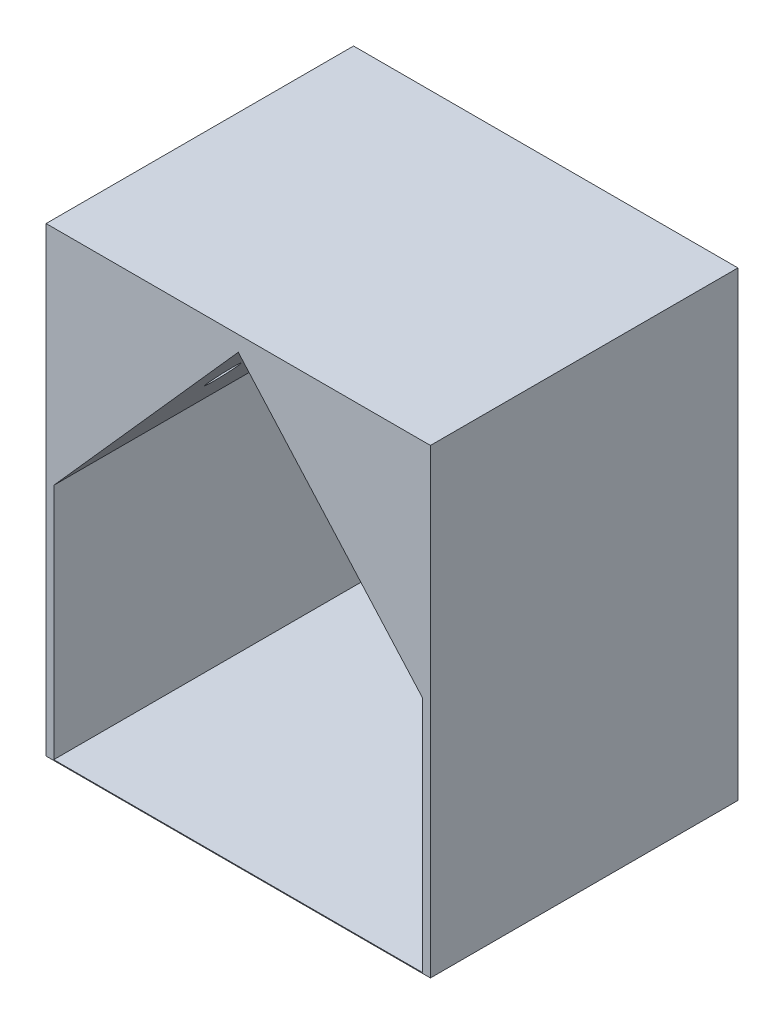
ISO-10303-21;
HEADER;
FILE_DESCRIPTION(('STEP AP214'),'2;1');
FILE_NAME('part.step','',(''),(''),'','','');
FILE_SCHEMA(('AUTOMOTIVE_DESIGN { 1 0 10303 214 1 1 1 1 }'));
ENDSEC;
DATA;
#1=APPLICATION_CONTEXT('core data for automotive mechanical design processes');
#2=APPLICATION_PROTOCOL_DEFINITION('international standard','automotive_design',2000,#1);
#3=PRODUCT_CONTEXT('',#1,'mechanical');
#4=PRODUCT('Part','Part','',(#3));
#5=PRODUCT_RELATED_PRODUCT_CATEGORY('part','',(#4));
#6=PRODUCT_DEFINITION_FORMATION('','',#4);
#7=PRODUCT_DEFINITION_CONTEXT('part definition',#1,'design');
#8=PRODUCT_DEFINITION('design','',#6,#7);
#9=PRODUCT_DEFINITION_SHAPE('','',#8);
#10=(LENGTH_UNIT() NAMED_UNIT(*) SI_UNIT(.MILLI.,.METRE.));
#11=(NAMED_UNIT(*) PLANE_ANGLE_UNIT() SI_UNIT($,.RADIAN.));
#12=(NAMED_UNIT(*) SI_UNIT($,.STERADIAN.) SOLID_ANGLE_UNIT());
#13=UNCERTAINTY_MEASURE_WITH_UNIT(LENGTH_MEASURE(1.E-05),#10,'distance_accuracy_value','');
#14=(GEOMETRIC_REPRESENTATION_CONTEXT(3) GLOBAL_UNCERTAINTY_ASSIGNED_CONTEXT((#13)) GLOBAL_UNIT_ASSIGNED_CONTEXT((#10,
#11,#12)) REPRESENTATION_CONTEXT('',''));
#15=CARTESIAN_POINT('',(0.,0.,0.));
#16=DIRECTION('',(0.,0.,1.));
#17=DIRECTION('',(1.,0.,0.));
#18=AXIS2_PLACEMENT_3D('',#15,#16,#17);
#19=CARTESIAN_POINT('',(-1250.,-1500.,2000.));
#20=DIRECTION('',(1.,0.,0.));
#21=DIRECTION('',(0.,0.,-1.));
#22=AXIS2_PLACEMENT_3D('',#19,#20,#21);
#23=PLANE('',#22);
#24=DIRECTION('',(0.,-1.,0.));
#25=VECTOR('',#24,1.);
#26=CARTESIAN_POINT('',(-1250.,-1500.,0.));
#27=LINE('',#26,#25);
#28=CARTESIAN_POINT('',(-1250.,1500.,0.));
#29=VERTEX_POINT('',#28);
#30=CARTESIAN_POINT('',(-1250.,-1500.,0.));
#31=VERTEX_POINT('',#30);
#32=EDGE_CURVE('E123',#29,#31,#27,.T.);
#33=ORIENTED_EDGE('',*,*,#32,.T.);
#34=DIRECTION('',(0.,0.,-1.));
#35=VECTOR('',#34,1.);
#36=CARTESIAN_POINT('',(-1250.,-1500.,2000.));
#37=LINE('',#36,#35);
#38=CARTESIAN_POINT('',(-1250.,-1500.,2000.));
#39=VERTEX_POINT('',#38);
#40=EDGE_CURVE('E174',#39,#31,#37,.T.);
#41=ORIENTED_EDGE('',*,*,#40,.F.);
#42=DIRECTION('',(0.,-1.,0.));
#43=VECTOR('',#42,1.);
#44=CARTESIAN_POINT('',(-1250.,-1500.,2000.));
#45=LINE('',#44,#43);
#46=CARTESIAN_POINT('',(-1250.,1500.,2000.));
#47=VERTEX_POINT('',#46);
#48=EDGE_CURVE('E154',#47,#39,#45,.T.);
#49=ORIENTED_EDGE('',*,*,#48,.F.);
#50=DIRECTION('',(0.,0.,-1.));
#51=VECTOR('',#50,1.);
#52=CARTESIAN_POINT('',(-1250.,1500.,2000.));
#53=LINE('',#52,#51);
#54=EDGE_CURVE('E160',#47,#29,#53,.T.);
#55=ORIENTED_EDGE('',*,*,#54,.T.);
#56=EDGE_LOOP('',(#33,#41,#49,#55));
#57=FACE_BOUND('',#56,.T.);
#58=ADVANCED_FACE('F35',(#57),#23,.F.);
#59=CARTESIAN_POINT('',(1250.,-1500.,2000.));
#60=DIRECTION('',(0.,1.,0.));
#61=DIRECTION('',(-1.,0.,0.));
#62=AXIS2_PLACEMENT_3D('',#59,#60,#61);
#63=PLANE('',#62);
#64=DIRECTION('',(1.,0.,0.));
#65=VECTOR('',#64,1.);
#66=CARTESIAN_POINT('',(1250.,-1500.,0.));
#67=LINE('',#66,#65);
#68=CARTESIAN_POINT('',(1250.,-1500.,0.));
#69=VERTEX_POINT('',#68);
#70=EDGE_CURVE('E163',#31,#69,#67,.T.);
#71=ORIENTED_EDGE('',*,*,#70,.T.);
#72=DIRECTION('',(0.,0.,-1.));
#73=VECTOR('',#72,1.);
#74=CARTESIAN_POINT('',(1250.,-1500.,2000.));
#75=LINE('',#74,#73);
#76=CARTESIAN_POINT('',(1250.,-1500.,2000.));
#77=VERTEX_POINT('',#76);
#78=EDGE_CURVE('E171',#77,#69,#75,.T.);
#79=ORIENTED_EDGE('',*,*,#78,.F.);
#80=DIRECTION('',(1.,0.,0.));
#81=VECTOR('',#80,1.);
#82=CARTESIAN_POINT('',(1250.,-1500.,2000.));
#83=LINE('',#82,#81);
#84=EDGE_CURVE('E87',#39,#77,#83,.T.);
#85=ORIENTED_EDGE('',*,*,#84,.F.);
#86=ORIENTED_EDGE('',*,*,#40,.T.);
#87=EDGE_LOOP('',(#71,#79,#85,#86));
#88=FACE_BOUND('',#87,.T.);
#89=ADVANCED_FACE('F206',(#88),#63,.F.);
#90=CARTESIAN_POINT('',(1250.,-1500.,2000.));
#91=DIRECTION('',(-1.,0.,0.));
#92=DIRECTION('',(0.,0.,1.));
#93=AXIS2_PLACEMENT_3D('',#90,#91,#92);
#94=PLANE('',#93);
#95=DIRECTION('',(0.,1.,0.));
#96=VECTOR('',#95,1.);
#97=CARTESIAN_POINT('',(1250.,-1500.,0.));
#98=LINE('',#97,#96);
#99=CARTESIAN_POINT('',(1250.,1500.,0.));
#100=VERTEX_POINT('',#99);
#101=EDGE_CURVE('E165',#69,#100,#98,.T.);
#102=ORIENTED_EDGE('',*,*,#101,.T.);
#103=DIRECTION('',(0.,0.,-1.));
#104=VECTOR('',#103,1.);
#105=CARTESIAN_POINT('',(1250.,1500.,2000.));
#106=LINE('',#105,#104);
#107=CARTESIAN_POINT('',(1250.,1500.,2000.));
#108=VERTEX_POINT('',#107);
#109=EDGE_CURVE('E169',#108,#100,#106,.T.);
#110=ORIENTED_EDGE('',*,*,#109,.F.);
#111=DIRECTION('',(0.,1.,0.));
#112=VECTOR('',#111,1.);
#113=CARTESIAN_POINT('',(1250.,-1500.,2000.));
#114=LINE('',#113,#112);
#115=EDGE_CURVE('E157',#77,#108,#114,.T.);
#116=ORIENTED_EDGE('',*,*,#115,.F.);
#117=ORIENTED_EDGE('',*,*,#78,.T.);
#118=EDGE_LOOP('',(#102,#110,#116,#117));
#119=FACE_BOUND('',#118,.T.);
#120=ADVANCED_FACE('F211',(#119),#94,.F.);
#121=CARTESIAN_POINT('',(1250.,1500.,2000.));
#122=DIRECTION('',(0.,-1.,0.));
#123=DIRECTION('',(1.,0.,0.));
#124=AXIS2_PLACEMENT_3D('',#121,#122,#123);
#125=PLANE('',#124);
#126=DIRECTION('',(-1.,0.,0.));
#127=VECTOR('',#126,1.);
#128=CARTESIAN_POINT('',(1250.,1500.,0.));
#129=LINE('',#128,#127);
#130=EDGE_CURVE('E79',#100,#29,#129,.T.);
#131=ORIENTED_EDGE('',*,*,#130,.T.);
#132=ORIENTED_EDGE('',*,*,#54,.F.);
#133=DIRECTION('',(-1.,0.,0.));
#134=VECTOR('',#133,1.);
#135=CARTESIAN_POINT('',(1250.,1500.,2000.));
#136=LINE('',#135,#134);
#137=EDGE_CURVE('E58',#108,#47,#136,.T.);
#138=ORIENTED_EDGE('',*,*,#137,.F.);
#139=ORIENTED_EDGE('',*,*,#109,.T.);
#140=EDGE_LOOP('',(#131,#132,#138,#139));
#141=FACE_BOUND('',#140,.T.);
#142=ADVANCED_FACE('F222',(#141),#125,.F.);
#143=CARTESIAN_POINT('',(0.,0.,2000.));
#144=DIRECTION('',(0.,0.,1.));
#145=DIRECTION('',(1.,0.,0.));
#146=AXIS2_PLACEMENT_3D('',#143,#144,#145);
#147=PLANE('',#146);
#148=DIRECTION('',(0.,-1.,0.));
#149=VECTOR('',#148,1.);
#150=CARTESIAN_POINT('',(-1200.,3.44811912201E-13,2000.));
#151=LINE('',#150,#149);
#152=CARTESIAN_POINT('',(-1200.,50.500700420784,2000.));
#153=VERTEX_POINT('',#152);
#154=CARTESIAN_POINT('',(-1200.,-1495.,2000.));
#155=VERTEX_POINT('',#154);
#156=EDGE_CURVE('E12',#153,#155,#151,.T.);
#157=ORIENTED_EDGE('',*,*,#156,.F.);
#158=DIRECTION('',(-0.664501503220268,-0.747286927637574,0.));
#159=VECTOR('',#158,1.);
#160=CARTESIAN_POINT('',(-695.202601452833,618.187146894795,2000.));
#161=LINE('',#160,#159);
#162=CARTESIAN_POINT('',(-6.66133814775094E-13,1400.,2000.));
#163=VERTEX_POINT('',#162);
#164=EDGE_CURVE('E176',#163,#153,#161,.T.);
#165=ORIENTED_EDGE('',*,*,#164,.F.);
#166=DIRECTION('',(-0.664501503220268,0.747286927637573,0.));
#167=VECTOR('',#166,1.);
#168=CARTESIAN_POINT('',(695.202601452832,618.187146894795,2000.));
#169=LINE('',#168,#167);
#170=CARTESIAN_POINT('',(1200.,50.5007004207844,2000.));
#171=VERTEX_POINT('',#170);
#172=EDGE_CURVE('E178',#171,#163,#169,.T.);
#173=ORIENTED_EDGE('',*,*,#172,.F.);
#174=DIRECTION('',(0.,1.,0.));
#175=VECTOR('',#174,1.);
#176=CARTESIAN_POINT('',(1200.,6.89623824402E-13,2000.));
#177=LINE('',#176,#175);
#178=CARTESIAN_POINT('',(1200.,-1495.,2000.));
#179=VERTEX_POINT('',#178);
#180=EDGE_CURVE('E180',#179,#171,#177,.T.);
#181=ORIENTED_EDGE('',*,*,#180,.F.);
#182=DIRECTION('',(-1.,0.,0.));
#183=VECTOR('',#182,1.);
#184=CARTESIAN_POINT('',(1.38315285151217E-13,-1495.,2000.));
#185=LINE('',#184,#183);
#186=EDGE_CURVE('E42',#179,#155,#185,.T.);
#187=ORIENTED_EDGE('',*,*,#186,.T.);
#188=EDGE_LOOP('',(#157,#165,#173,#181,#187));
#189=FACE_BOUND('',#188,.T.);
#190=ORIENTED_EDGE('',*,*,#48,.T.);
#191=ORIENTED_EDGE('',*,*,#84,.T.);
#192=ORIENTED_EDGE('',*,*,#115,.T.);
#193=ORIENTED_EDGE('',*,*,#137,.T.);
#194=EDGE_LOOP('',(#190,#191,#192,#193));
#195=FACE_BOUND('',#194,.T.);
#196=ADVANCED_FACE('F183',(#189,#195),#147,.T.);
#197=CARTESIAN_POINT('',(0.,0.,0.));
#198=DIRECTION('',(0.,0.,1.));
#199=DIRECTION('',(1.,0.,0.));
#200=AXIS2_PLACEMENT_3D('',#197,#198,#199);
#201=PLANE('',#200);
#202=ORIENTED_EDGE('',*,*,#32,.F.);
#203=ORIENTED_EDGE('',*,*,#130,.F.);
#204=ORIENTED_EDGE('',*,*,#101,.F.);
#205=ORIENTED_EDGE('',*,*,#70,.F.);
#206=EDGE_LOOP('',(#202,#203,#204,#205));
#207=FACE_BOUND('',#206,.T.);
#208=ADVANCED_FACE('F216',(#207),#201,.F.);
#209=CARTESIAN_POINT('',(-1200.,3.44811912201E-13,2000.000012));
#210=DIRECTION('',(-1.,0.,0.));
#211=DIRECTION('',(0.,-1.,0.));
#212=AXIS2_PLACEMENT_3D('',#209,#210,#211);
#213=PLANE('',#212);
#214=ORIENTED_EDGE('',*,*,#156,.T.);
#215=DIRECTION('',(0.,0.,-1.));
#216=VECTOR('',#215,1.);
#217=CARTESIAN_POINT('',(-1200.,-1495.,2000.000012));
#218=LINE('',#217,#216);
#219=CARTESIAN_POINT('',(-1200.,-1495.,4.99999999999989));
#220=VERTEX_POINT('',#219);
#221=EDGE_CURVE('E114',#155,#220,#218,.T.);
#222=ORIENTED_EDGE('',*,*,#221,.T.);
#223=DIRECTION('',(0.,1.,0.));
#224=VECTOR('',#223,1.);
#225=CARTESIAN_POINT('',(-1200.,3.44811912201E-13,4.99999999999989));
#226=LINE('',#225,#224);
#227=CARTESIAN_POINT('',(-1200.,50.500700420784,4.99999999999989));
#228=VERTEX_POINT('',#227);
#229=EDGE_CURVE('E118',#220,#228,#226,.T.);
#230=ORIENTED_EDGE('',*,*,#229,.T.);
#231=DIRECTION('',(0.,0.,-1.));
#232=VECTOR('',#231,1.);
#233=CARTESIAN_POINT('',(-1200.,50.500700420784,2000.000012));
#234=LINE('',#233,#232);
#235=EDGE_CURVE('E148',#153,#228,#234,.T.);
#236=ORIENTED_EDGE('',*,*,#235,.F.);
#237=EDGE_LOOP('',(#214,#222,#230,#236));
#238=FACE_BOUND('',#237,.T.);
#239=ADVANCED_FACE('F116',(#238),#213,.F.);
#240=CARTESIAN_POINT('',(1.38315285151217E-13,-1495.,2000.000012));
#241=DIRECTION('',(0.,1.,0.));
#242=DIRECTION('',(-1.,0.,0.));
#243=AXIS2_PLACEMENT_3D('',#240,#241,#242);
#244=PLANE('',#243);
#245=DIRECTION('',(0.,0.,-1.));
#246=VECTOR('',#245,1.);
#247=CARTESIAN_POINT('',(1200.,-1495.,2000.000012));
#248=LINE('',#247,#246);
#249=CARTESIAN_POINT('',(1200.,-1495.,4.99999999999989));
#250=VERTEX_POINT('',#249);
#251=EDGE_CURVE('E124',#179,#250,#248,.T.);
#252=ORIENTED_EDGE('',*,*,#251,.T.);
#253=DIRECTION('',(1.,0.,0.));
#254=VECTOR('',#253,1.);
#255=CARTESIAN_POINT('',(1.38315285151217E-13,-1495.,4.99999999999989));
#256=LINE('',#255,#254);
#257=EDGE_CURVE('E131',#220,#250,#256,.T.);
#258=ORIENTED_EDGE('',*,*,#257,.F.);
#259=ORIENTED_EDGE('',*,*,#221,.F.);
#260=ORIENTED_EDGE('',*,*,#186,.F.);
#261=EDGE_LOOP('',(#252,#258,#259,#260));
#262=FACE_BOUND('',#261,.T.);
#263=ADVANCED_FACE('F136',(#262),#244,.T.);
#264=CARTESIAN_POINT('',(1200.,6.89623824402E-13,2000.000012));
#265=DIRECTION('',(1.,0.,0.));
#266=DIRECTION('',(0.,1.,0.));
#267=AXIS2_PLACEMENT_3D('',#264,#265,#266);
#268=PLANE('',#267);
#269=ORIENTED_EDGE('',*,*,#180,.T.);
#270=DIRECTION('',(0.,0.,-1.));
#271=VECTOR('',#270,1.);
#272=CARTESIAN_POINT('',(1200.,50.5007004207844,2000.000012));
#273=LINE('',#272,#271);
#274=CARTESIAN_POINT('',(1200.,50.5007004207844,4.99999999999989));
#275=VERTEX_POINT('',#274);
#276=EDGE_CURVE('E151',#171,#275,#273,.T.);
#277=ORIENTED_EDGE('',*,*,#276,.T.);
#278=DIRECTION('',(0.,-1.,0.));
#279=VECTOR('',#278,1.);
#280=CARTESIAN_POINT('',(1200.,6.89623824402E-13,4.99999999999989));
#281=LINE('',#280,#279);
#282=EDGE_CURVE('E139',#275,#250,#281,.T.);
#283=ORIENTED_EDGE('',*,*,#282,.T.);
#284=ORIENTED_EDGE('',*,*,#251,.F.);
#285=EDGE_LOOP('',(#269,#277,#283,#284));
#286=FACE_BOUND('',#285,.T.);
#287=ADVANCED_FACE('F187',(#286),#268,.F.);
#288=CARTESIAN_POINT('',(695.202601452832,618.187146894795,2000.000012));
#289=DIRECTION('',(0.747286927637573,0.664501503220268,0.));
#290=DIRECTION('',(-0.664501503220268,0.747286927637573,0.));
#291=AXIS2_PLACEMENT_3D('',#288,#289,#290);
#292=PLANE('',#291);
#293=CARTESIAN_POINT('',(600.,725.250350210393,1500.));
#294=DIRECTION('',(-0.747286927637573,-0.664501503220268,0.));
#295=DIRECTION('',(0.664501503220268,-0.747286927637573,0.));
#296=AXIS2_PLACEMENT_3D('',#293,#294,#295);
#297=CIRCLE('',#296,100.);
#298=CARTESIAN_POINT('',(666.450150322027,650.521657446635,1500.));
#299=VERTEX_POINT('',#298);
#300=EDGE_CURVE('E438',#299,#299,#297,.T.);
#301=ORIENTED_EDGE('',*,*,#300,.F.);
#302=EDGE_LOOP('',(#301));
#303=FACE_BOUND('',#302,.T.);
#304=CARTESIAN_POINT('',(600.,725.250350210393,1002.5));
#305=DIRECTION('',(-0.747286927637573,-0.664501503220268,0.));
#306=DIRECTION('',(0.664501503220268,-0.747286927637573,0.));
#307=AXIS2_PLACEMENT_3D('',#304,#305,#306);
#308=CIRCLE('',#307,100.);
#309=CARTESIAN_POINT('',(666.450150322027,650.521657446635,1002.5));
#310=VERTEX_POINT('',#309);
#311=EDGE_CURVE('E444',#310,#310,#308,.T.);
#312=ORIENTED_EDGE('',*,*,#311,.F.);
#313=EDGE_LOOP('',(#312));
#314=FACE_BOUND('',#313,.T.);
#315=CARTESIAN_POINT('',(600.,725.250350210393,502.5));
#316=DIRECTION('',(-0.747286927637573,-0.664501503220268,0.));
#317=DIRECTION('',(0.664501503220268,-0.747286927637573,0.));
#318=AXIS2_PLACEMENT_3D('',#315,#316,#317);
#319=CIRCLE('',#318,100.);
#320=CARTESIAN_POINT('',(666.450150322027,650.521657446635,502.5));
#321=VERTEX_POINT('',#320);
#322=EDGE_CURVE('E416',#321,#321,#319,.T.);
#323=ORIENTED_EDGE('',*,*,#322,.F.);
#324=EDGE_LOOP('',(#323));
#325=FACE_BOUND('',#324,.T.);
#326=ORIENTED_EDGE('',*,*,#172,.T.);
#327=DIRECTION('',(0.,0.,-1.));
#328=VECTOR('',#327,1.);
#329=CARTESIAN_POINT('',(-5.55111512312578E-13,1400.,2000.000012));
#330=LINE('',#329,#328);
#331=CARTESIAN_POINT('',(-5.55111512312578E-13,1400.,4.99999999999989));
#332=VERTEX_POINT('',#331);
#333=EDGE_CURVE('E49',#163,#332,#330,.T.);
#334=ORIENTED_EDGE('',*,*,#333,.T.);
#335=DIRECTION('',(0.664501503220268,-0.747286927637573,0.));
#336=VECTOR('',#335,1.);
#337=CARTESIAN_POINT('',(695.202601452832,618.187146894795,4.99999999999989));
#338=LINE('',#337,#336);
#339=EDGE_CURVE('E141',#332,#275,#338,.T.);
#340=ORIENTED_EDGE('',*,*,#339,.T.);
#341=ORIENTED_EDGE('',*,*,#276,.F.);
#342=EDGE_LOOP('',(#326,#334,#340,#341));
#343=FACE_BOUND('',#342,.T.);
#344=ADVANCED_FACE('F190',(#303,#314,#325,#343),#292,.F.);
#345=CARTESIAN_POINT('',(-695.202601452833,618.187146894795,2000.000012));
#346=DIRECTION('',(-0.747286927637574,0.664501503220268,0.));
#347=DIRECTION('',(-0.664501503220268,-0.747286927637574,0.));
#348=AXIS2_PLACEMENT_3D('',#345,#346,#347);
#349=PLANE('',#348);
#350=CARTESIAN_POINT('',(-600.,725.250350210392,1500.));
#351=DIRECTION('',(0.747286927637574,-0.664501503220268,0.));
#352=DIRECTION('',(0.664501503220268,0.747286927637574,0.));
#353=AXIS2_PLACEMENT_3D('',#350,#351,#352);
#354=CIRCLE('',#353,100.);
#355=CARTESIAN_POINT('',(-533.549849677973,799.97904297415,1500.));
#356=VERTEX_POINT('',#355);
#357=EDGE_CURVE('E417',#356,#356,#354,.T.);
#358=ORIENTED_EDGE('',*,*,#357,.F.);
#359=EDGE_LOOP('',(#358));
#360=FACE_BOUND('',#359,.T.);
#361=CARTESIAN_POINT('',(-600.,725.250350210392,1000.));
#362=DIRECTION('',(0.747286927637574,-0.664501503220268,0.));
#363=DIRECTION('',(0.664501503220268,0.747286927637574,0.));
#364=AXIS2_PLACEMENT_3D('',#361,#362,#363);
#365=CIRCLE('',#364,100.);
#366=CARTESIAN_POINT('',(-533.549849677973,799.979042974149,1000.));
#367=VERTEX_POINT('',#366);
#368=EDGE_CURVE('E427',#367,#367,#365,.T.);
#369=ORIENTED_EDGE('',*,*,#368,.F.);
#370=EDGE_LOOP('',(#369));
#371=FACE_BOUND('',#370,.T.);
#372=CARTESIAN_POINT('',(-600.,725.250350210392,502.5));
#373=DIRECTION('',(0.747286927637574,-0.664501503220268,0.));
#374=DIRECTION('',(0.664501503220268,0.747286927637574,0.));
#375=AXIS2_PLACEMENT_3D('',#372,#373,#374);
#376=CIRCLE('',#375,100.);
#377=CARTESIAN_POINT('',(-533.549849677973,799.97904297415,502.5));
#378=VERTEX_POINT('',#377);
#379=EDGE_CURVE('E433',#378,#378,#376,.T.);
#380=ORIENTED_EDGE('',*,*,#379,.F.);
#381=EDGE_LOOP('',(#380));
#382=FACE_BOUND('',#381,.T.);
#383=ORIENTED_EDGE('',*,*,#164,.T.);
#384=ORIENTED_EDGE('',*,*,#235,.T.);
#385=DIRECTION('',(0.664501503220268,0.747286927637574,0.));
#386=VECTOR('',#385,1.);
#387=CARTESIAN_POINT('',(-695.202601452833,618.187146894795,4.99999999999989));
#388=LINE('',#387,#386);
#389=EDGE_CURVE('E133',#228,#332,#388,.T.);
#390=ORIENTED_EDGE('',*,*,#389,.T.);
#391=ORIENTED_EDGE('',*,*,#333,.F.);
#392=EDGE_LOOP('',(#383,#384,#390,#391));
#393=FACE_BOUND('',#392,.T.);
#394=ADVANCED_FACE('F191',(#360,#371,#382,#393),#349,.F.);
#395=CARTESIAN_POINT('',(0.,0.,4.99999999999989));
#396=DIRECTION('',(0.,0.,1.));
#397=DIRECTION('',(1.,0.,0.));
#398=AXIS2_PLACEMENT_3D('',#395,#396,#397);
#399=PLANE('',#398);
#400=ORIENTED_EDGE('',*,*,#229,.F.);
#401=ORIENTED_EDGE('',*,*,#257,.T.);
#402=ORIENTED_EDGE('',*,*,#282,.F.);
#403=ORIENTED_EDGE('',*,*,#339,.F.);
#404=ORIENTED_EDGE('',*,*,#389,.F.);
#405=EDGE_LOOP('',(#400,#401,#402,#403,#404));
#406=FACE_BOUND('',#405,.T.);
#407=ADVANCED_FACE('F129',(#406),#399,.T.);
#408=CARTESIAN_POINT('',(614.945738552751,738.540380274798,502.5));
#409=DIRECTION('',(-0.747286927637573,-0.664501503220268,0.));
#410=DIRECTION('',(0.664501503220268,-0.747286927637573,0.));
#411=AXIS2_PLACEMENT_3D('',#408,#409,#410);
#412=CYLINDRICAL_SURFACE('',#411,100.);
#413=CARTESIAN_POINT('',(614.945738552751,738.540380274798,502.5));
#414=DIRECTION('',(-0.747286927637573,-0.664501503220268,0.));
#415=DIRECTION('',(0.664501503220268,-0.747286927637573,0.));
#416=AXIS2_PLACEMENT_3D('',#413,#414,#415);
#417=CIRCLE('',#416,100.);
#418=CARTESIAN_POINT('',(681.395888874778,663.81168751104,502.5));
#419=VERTEX_POINT('',#418);
#420=EDGE_CURVE('E420',#419,#419,#417,.T.);
#421=ORIENTED_EDGE('',*,*,#420,.F.);
#422=EDGE_LOOP('',(#421));
#423=FACE_BOUND('',#422,.T.);
#424=ORIENTED_EDGE('',*,*,#322,.T.);
#425=EDGE_LOOP('',(#424));
#426=FACE_BOUND('',#425,.T.);
#427=ADVANCED_FACE('F199',(#423,#426),#412,.F.);
#428=CARTESIAN_POINT('',(614.945738552751,738.540380274798,502.5));
#429=DIRECTION('',(-0.747286927637573,-0.664501503220268,0.));
#430=DIRECTION('',(0.664501503220268,-0.747286927637573,0.));
#431=AXIS2_PLACEMENT_3D('',#428,#429,#430);
#432=PLANE('',#431);
#433=ORIENTED_EDGE('',*,*,#420,.T.);
#434=EDGE_LOOP('',(#433));
#435=FACE_BOUND('',#434,.T.);
#436=ADVANCED_FACE('F296',(#435),#432,.T.);
#437=CARTESIAN_POINT('',(614.945738552751,738.540380274798,1002.5));
#438=DIRECTION('',(-0.747286927637573,-0.664501503220268,0.));
#439=DIRECTION('',(0.664501503220268,-0.747286927637573,0.));
#440=AXIS2_PLACEMENT_3D('',#437,#438,#439);
#441=CYLINDRICAL_SURFACE('',#440,100.);
#442=CARTESIAN_POINT('',(614.945738552751,738.540380274798,1002.5));
#443=DIRECTION('',(-0.747286927637573,-0.664501503220268,0.));
#444=DIRECTION('',(0.664501503220268,-0.747286927637573,0.));
#445=AXIS2_PLACEMENT_3D('',#442,#443,#444);
#446=CIRCLE('',#445,100.);
#447=CARTESIAN_POINT('',(681.395888874778,663.811687511041,1002.5));
#448=VERTEX_POINT('',#447);
#449=EDGE_CURVE('E441',#448,#448,#446,.T.);
#450=ORIENTED_EDGE('',*,*,#449,.F.);
#451=EDGE_LOOP('',(#450));
#452=FACE_BOUND('',#451,.T.);
#453=ORIENTED_EDGE('',*,*,#311,.T.);
#454=EDGE_LOOP('',(#453));
#455=FACE_BOUND('',#454,.T.);
#456=ADVANCED_FACE('F306',(#452,#455),#441,.F.);
#457=CARTESIAN_POINT('',(614.945738552751,738.540380274798,1002.5));
#458=DIRECTION('',(-0.747286927637573,-0.664501503220268,0.));
#459=DIRECTION('',(0.664501503220268,-0.747286927637573,0.));
#460=AXIS2_PLACEMENT_3D('',#457,#458,#459);
#461=PLANE('',#460);
#462=ORIENTED_EDGE('',*,*,#449,.T.);
#463=EDGE_LOOP('',(#462));
#464=FACE_BOUND('',#463,.T.);
#465=ADVANCED_FACE('F316',(#464),#461,.T.);
#466=CARTESIAN_POINT('',(614.945738552751,738.540380274798,1500.));
#467=DIRECTION('',(-0.747286927637573,-0.664501503220268,0.));
#468=DIRECTION('',(0.664501503220268,-0.747286927637573,0.));
#469=AXIS2_PLACEMENT_3D('',#466,#467,#468);
#470=CYLINDRICAL_SURFACE('',#469,100.);
#471=CARTESIAN_POINT('',(614.945738552751,738.540380274798,1500.));
#472=DIRECTION('',(-0.747286927637573,-0.664501503220268,0.));
#473=DIRECTION('',(0.664501503220268,-0.747286927637573,0.));
#474=AXIS2_PLACEMENT_3D('',#471,#472,#473);
#475=CIRCLE('',#474,100.);
#476=CARTESIAN_POINT('',(681.395888874778,663.811687511041,1500.));
#477=VERTEX_POINT('',#476);
#478=EDGE_CURVE('E134',#477,#477,#475,.T.);
#479=ORIENTED_EDGE('',*,*,#478,.F.);
#480=EDGE_LOOP('',(#479));
#481=FACE_BOUND('',#480,.T.);
#482=ORIENTED_EDGE('',*,*,#300,.T.);
#483=EDGE_LOOP('',(#482));
#484=FACE_BOUND('',#483,.T.);
#485=ADVANCED_FACE('F326',(#481,#484),#470,.F.);
#486=CARTESIAN_POINT('',(614.945738552751,738.540380274798,1500.));
#487=DIRECTION('',(-0.747286927637573,-0.664501503220268,0.));
#488=DIRECTION('',(0.664501503220268,-0.747286927637573,0.));
#489=AXIS2_PLACEMENT_3D('',#486,#487,#488);
#490=PLANE('',#489);
#491=ORIENTED_EDGE('',*,*,#478,.T.);
#492=EDGE_LOOP('',(#491));
#493=FACE_BOUND('',#492,.T.);
#494=ADVANCED_FACE('F336',(#493),#490,.T.);
#495=CARTESIAN_POINT('',(-614.945738552752,738.540380274797,502.5));
#496=DIRECTION('',(0.747286927637574,-0.664501503220268,0.));
#497=DIRECTION('',(0.664501503220268,0.747286927637574,0.));
#498=AXIS2_PLACEMENT_3D('',#495,#496,#497);
#499=CYLINDRICAL_SURFACE('',#498,100.);
#500=CARTESIAN_POINT('',(-614.945738552752,738.540380274797,502.5));
#501=DIRECTION('',(0.747286927637574,-0.664501503220268,0.));
#502=DIRECTION('',(0.664501503220268,0.747286927637574,0.));
#503=AXIS2_PLACEMENT_3D('',#500,#501,#502);
#504=CIRCLE('',#503,100.);
#505=CARTESIAN_POINT('',(-548.495588230725,813.269073038555,502.5));
#506=VERTEX_POINT('',#505);
#507=EDGE_CURVE('E430',#506,#506,#504,.T.);
#508=ORIENTED_EDGE('',*,*,#507,.F.);
#509=EDGE_LOOP('',(#508));
#510=FACE_BOUND('',#509,.T.);
#511=ORIENTED_EDGE('',*,*,#379,.T.);
#512=EDGE_LOOP('',(#511));
#513=FACE_BOUND('',#512,.T.);
#514=ADVANCED_FACE('F345',(#510,#513),#499,.F.);
#515=CARTESIAN_POINT('',(-614.945738552752,738.540380274797,502.5));
#516=DIRECTION('',(0.747286927637574,-0.664501503220268,0.));
#517=DIRECTION('',(0.664501503220268,0.747286927637574,0.));
#518=AXIS2_PLACEMENT_3D('',#515,#516,#517);
#519=PLANE('',#518);
#520=ORIENTED_EDGE('',*,*,#507,.T.);
#521=EDGE_LOOP('',(#520));
#522=FACE_BOUND('',#521,.T.);
#523=ADVANCED_FACE('F359',(#522),#519,.T.);
#524=CARTESIAN_POINT('',(-614.945738552752,738.540380274797,1000.));
#525=DIRECTION('',(0.747286927637574,-0.664501503220268,0.));
#526=DIRECTION('',(0.664501503220268,0.747286927637574,0.));
#527=AXIS2_PLACEMENT_3D('',#524,#525,#526);
#528=CYLINDRICAL_SURFACE('',#527,100.);
#529=CARTESIAN_POINT('',(-614.945738552752,738.540380274797,1000.));
#530=DIRECTION('',(0.747286927637574,-0.664501503220268,0.));
#531=DIRECTION('',(0.664501503220268,0.747286927637574,0.));
#532=AXIS2_PLACEMENT_3D('',#529,#530,#531);
#533=CIRCLE('',#532,100.);
#534=CARTESIAN_POINT('',(-548.495588230725,813.269073038555,1000.));
#535=VERTEX_POINT('',#534);
#536=EDGE_CURVE('E422',#535,#535,#533,.T.);
#537=ORIENTED_EDGE('',*,*,#536,.F.);
#538=EDGE_LOOP('',(#537));
#539=FACE_BOUND('',#538,.T.);
#540=ORIENTED_EDGE('',*,*,#368,.T.);
#541=EDGE_LOOP('',(#540));
#542=FACE_BOUND('',#541,.T.);
#543=ADVANCED_FACE('F369',(#539,#542),#528,.F.);
#544=CARTESIAN_POINT('',(-614.945738552752,738.540380274797,1000.));
#545=DIRECTION('',(0.747286927637574,-0.664501503220268,0.));
#546=DIRECTION('',(0.664501503220268,0.747286927637574,0.));
#547=AXIS2_PLACEMENT_3D('',#544,#545,#546);
#548=PLANE('',#547);
#549=ORIENTED_EDGE('',*,*,#536,.T.);
#550=EDGE_LOOP('',(#549));
#551=FACE_BOUND('',#550,.T.);
#552=ADVANCED_FACE('F379',(#551),#548,.T.);
#553=CARTESIAN_POINT('',(-614.945738552752,738.540380274797,1500.));
#554=DIRECTION('',(0.747286927637574,-0.664501503220268,0.));
#555=DIRECTION('',(0.664501503220268,0.747286927637574,0.));
#556=AXIS2_PLACEMENT_3D('',#553,#554,#555);
#557=CYLINDRICAL_SURFACE('',#556,100.);
#558=CARTESIAN_POINT('',(-614.945738552752,738.540380274797,1500.));
#559=DIRECTION('',(0.747286927637574,-0.664501503220268,0.));
#560=DIRECTION('',(0.664501503220268,0.747286927637574,0.));
#561=AXIS2_PLACEMENT_3D('',#558,#559,#560);
#562=CIRCLE('',#561,100.);
#563=CARTESIAN_POINT('',(-548.495588230725,813.269073038555,1500.));
#564=VERTEX_POINT('',#563);
#565=EDGE_CURVE('E415',#564,#564,#562,.T.);
#566=ORIENTED_EDGE('',*,*,#565,.F.);
#567=EDGE_LOOP('',(#566));
#568=FACE_BOUND('',#567,.T.);
#569=ORIENTED_EDGE('',*,*,#357,.T.);
#570=EDGE_LOOP('',(#569));
#571=FACE_BOUND('',#570,.T.);
#572=ADVANCED_FACE('F389',(#568,#571),#557,.F.);
#573=CARTESIAN_POINT('',(-614.945738552752,738.540380274797,1500.));
#574=DIRECTION('',(0.747286927637574,-0.664501503220268,0.));
#575=DIRECTION('',(0.664501503220268,0.747286927637574,0.));
#576=AXIS2_PLACEMENT_3D('',#573,#574,#575);
#577=PLANE('',#576);
#578=ORIENTED_EDGE('',*,*,#565,.T.);
#579=EDGE_LOOP('',(#578));
#580=FACE_BOUND('',#579,.T.);
#581=ADVANCED_FACE('F399',(#580),#577,.T.);
#582=CLOSED_SHELL('',(#58,#89,#120,#142,#196,#208,#239,#263,#287,#344,#394,#407,#427,#436,#456,
#465,#485,#494,#514,#523,#543,#552,#572,#581));
#583=MANIFOLD_SOLID_BREP('B2',#582);
#584=ADVANCED_BREP_SHAPE_REPRESENTATION('',(#18,#583),#14);
#585=SHAPE_DEFINITION_REPRESENTATION(#9,#584);
ENDSEC;
END-ISO-10303-21;
